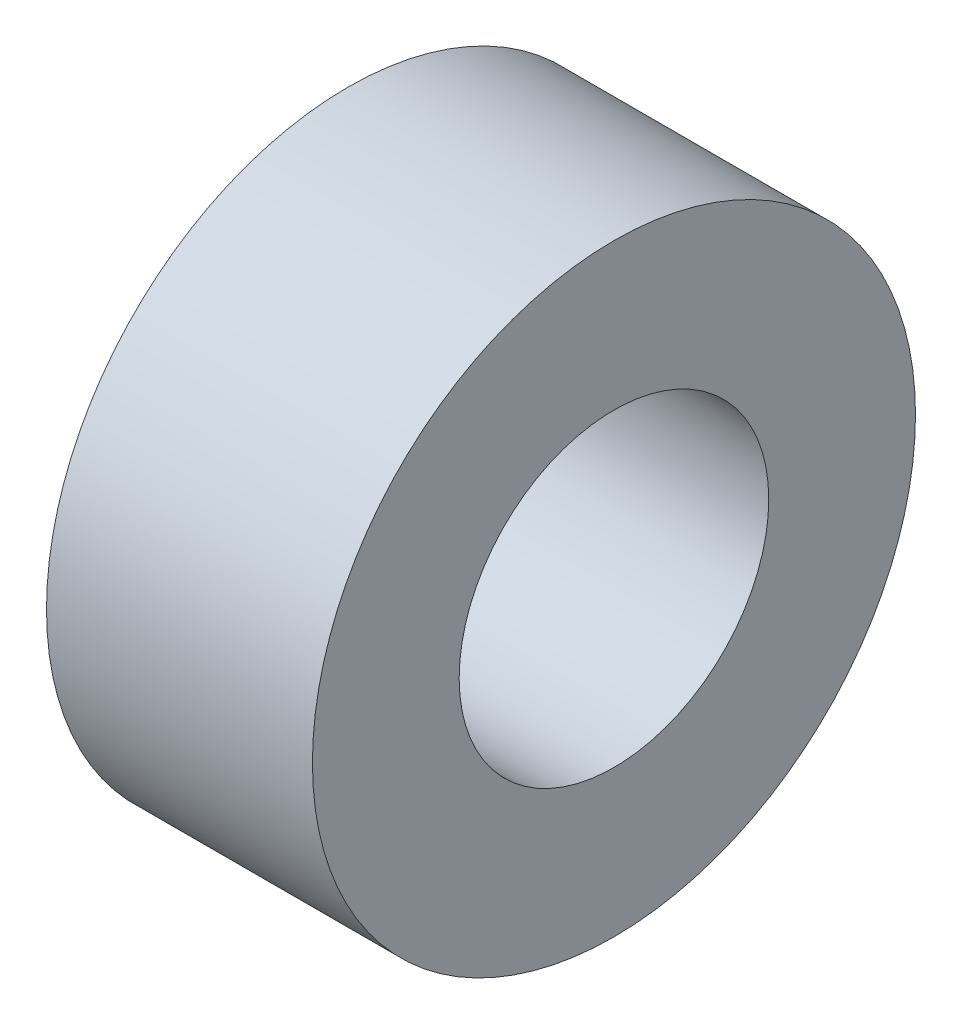
ISO-10303-21;
HEADER;
FILE_DESCRIPTION(('STEP AP214'),'2;1');
FILE_NAME('part.step','',(''),(''),'','','');
FILE_SCHEMA(('AUTOMOTIVE_DESIGN { 1 0 10303 214 1 1 1 1 }'));
ENDSEC;
DATA;
#1=APPLICATION_CONTEXT('core data for automotive mechanical design processes');
#2=APPLICATION_PROTOCOL_DEFINITION('international standard','automotive_design',2000,#1);
#3=PRODUCT_CONTEXT('',#1,'mechanical');
#4=PRODUCT('Part','Part','',(#3));
#5=PRODUCT_RELATED_PRODUCT_CATEGORY('part','',(#4));
#6=PRODUCT_DEFINITION_FORMATION('','',#4);
#7=PRODUCT_DEFINITION_CONTEXT('part definition',#1,'design');
#8=PRODUCT_DEFINITION('design','',#6,#7);
#9=PRODUCT_DEFINITION_SHAPE('','',#8);
#10=(LENGTH_UNIT() NAMED_UNIT(*) SI_UNIT(.MILLI.,.METRE.));
#11=(NAMED_UNIT(*) PLANE_ANGLE_UNIT() SI_UNIT($,.RADIAN.));
#12=(NAMED_UNIT(*) SI_UNIT($,.STERADIAN.) SOLID_ANGLE_UNIT());
#13=UNCERTAINTY_MEASURE_WITH_UNIT(LENGTH_MEASURE(1.E-05),#10,'distance_accuracy_value','');
#14=(GEOMETRIC_REPRESENTATION_CONTEXT(3) GLOBAL_UNCERTAINTY_ASSIGNED_CONTEXT((#13)) GLOBAL_UNIT_ASSIGNED_CONTEXT((#10,
#11,#12)) REPRESENTATION_CONTEXT('',''));
#15=CARTESIAN_POINT('',(0.,0.,0.));
#16=DIRECTION('',(0.,0.,1.));
#17=DIRECTION('',(1.,0.,0.));
#18=AXIS2_PLACEMENT_3D('',#15,#16,#17);
#19=CARTESIAN_POINT('',(7.,0.,0.));
#20=DIRECTION('',(-1.,0.,0.));
#21=DIRECTION('',(0.,0.,1.));
#22=AXIS2_PLACEMENT_3D('',#19,#20,#21);
#23=CYLINDRICAL_SURFACE('',#22,7.9375);
#24=CARTESIAN_POINT('',(7.,0.,0.));
#25=DIRECTION('',(1.,0.,0.));
#26=DIRECTION('',(0.,0.,-1.));
#27=AXIS2_PLACEMENT_3D('',#24,#25,#26);
#28=CIRCLE('',#27,7.9375);
#29=CARTESIAN_POINT('',(7.,0.,-7.9375));
#30=VERTEX_POINT('',#29);
#31=EDGE_CURVE('E10',#30,#30,#28,.T.);
#32=ORIENTED_EDGE('',*,*,#31,.F.);
#33=EDGE_LOOP('',(#32));
#34=FACE_BOUND('',#33,.T.);
#35=CARTESIAN_POINT('',(0.,0.,0.));
#36=DIRECTION('',(1.,0.,0.));
#37=DIRECTION('',(0.,0.,-1.));
#38=AXIS2_PLACEMENT_3D('',#35,#36,#37);
#39=CIRCLE('',#38,7.9375);
#40=CARTESIAN_POINT('',(0.,0.,-7.9375));
#41=VERTEX_POINT('',#40);
#42=EDGE_CURVE('E42',#41,#41,#39,.T.);
#43=ORIENTED_EDGE('',*,*,#42,.T.);
#44=EDGE_LOOP('',(#43));
#45=FACE_BOUND('',#44,.T.);
#46=ADVANCED_FACE('F35',(#34,#45),#23,.T.);
#47=CARTESIAN_POINT('',(7.,0.,0.));
#48=DIRECTION('',(1.,0.,0.));
#49=DIRECTION('',(0.,0.,-1.));
#50=AXIS2_PLACEMENT_3D('',#47,#48,#49);
#51=PLANE('',#50);
#52=CARTESIAN_POINT('',(7.,0.,0.));
#53=DIRECTION('',(1.,0.,0.));
#54=DIRECTION('',(0.,0.,-1.));
#55=AXIS2_PLACEMENT_3D('',#52,#53,#54);
#56=CIRCLE('',#55,4.075);
#57=CARTESIAN_POINT('',(7.,0.,-4.075));
#58=VERTEX_POINT('',#57);
#59=EDGE_CURVE('E48',#58,#58,#56,.T.);
#60=ORIENTED_EDGE('',*,*,#59,.F.);
#61=EDGE_LOOP('',(#60));
#62=FACE_BOUND('',#61,.T.);
#63=ORIENTED_EDGE('',*,*,#31,.T.);
#64=EDGE_LOOP('',(#63));
#65=FACE_BOUND('',#64,.T.);
#66=ADVANCED_FACE('F64',(#62,#65),#51,.T.);
#67=CARTESIAN_POINT('',(0.,0.,0.));
#68=DIRECTION('',(1.,0.,0.));
#69=DIRECTION('',(0.,0.,-1.));
#70=AXIS2_PLACEMENT_3D('',#67,#68,#69);
#71=PLANE('',#70);
#72=CARTESIAN_POINT('',(0.,0.,0.));
#73=DIRECTION('',(1.,0.,0.));
#74=DIRECTION('',(0.,0.,-1.));
#75=AXIS2_PLACEMENT_3D('',#72,#73,#74);
#76=CIRCLE('',#75,4.075);
#77=CARTESIAN_POINT('',(0.,0.,-4.075));
#78=VERTEX_POINT('',#77);
#79=EDGE_CURVE('E38',#78,#78,#76,.T.);
#80=ORIENTED_EDGE('',*,*,#79,.T.);
#81=EDGE_LOOP('',(#80));
#82=FACE_BOUND('',#81,.T.);
#83=ORIENTED_EDGE('',*,*,#42,.F.);
#84=EDGE_LOOP('',(#83));
#85=FACE_BOUND('',#84,.T.);
#86=ADVANCED_FACE('F55',(#82,#85),#71,.F.);
#87=CARTESIAN_POINT('',(-8.,0.,0.));
#88=DIRECTION('',(1.,0.,0.));
#89=DIRECTION('',(0.,0.,-1.));
#90=AXIS2_PLACEMENT_3D('',#87,#88,#89);
#91=CYLINDRICAL_SURFACE('',#90,4.075);
#92=ORIENTED_EDGE('',*,*,#59,.T.);
#93=EDGE_LOOP('',(#92));
#94=FACE_BOUND('',#93,.T.);
#95=ORIENTED_EDGE('',*,*,#79,.F.);
#96=EDGE_LOOP('',(#95));
#97=FACE_BOUND('',#96,.T.);
#98=ADVANCED_FACE('F58',(#94,#97),#91,.F.);
#99=CLOSED_SHELL('',(#46,#66,#86,#98));
#100=MANIFOLD_SOLID_BREP('B2',#99);
#101=ADVANCED_BREP_SHAPE_REPRESENTATION('',(#18,#100),#14);
#102=SHAPE_DEFINITION_REPRESENTATION(#9,#101);
ENDSEC;
END-ISO-10303-21;
